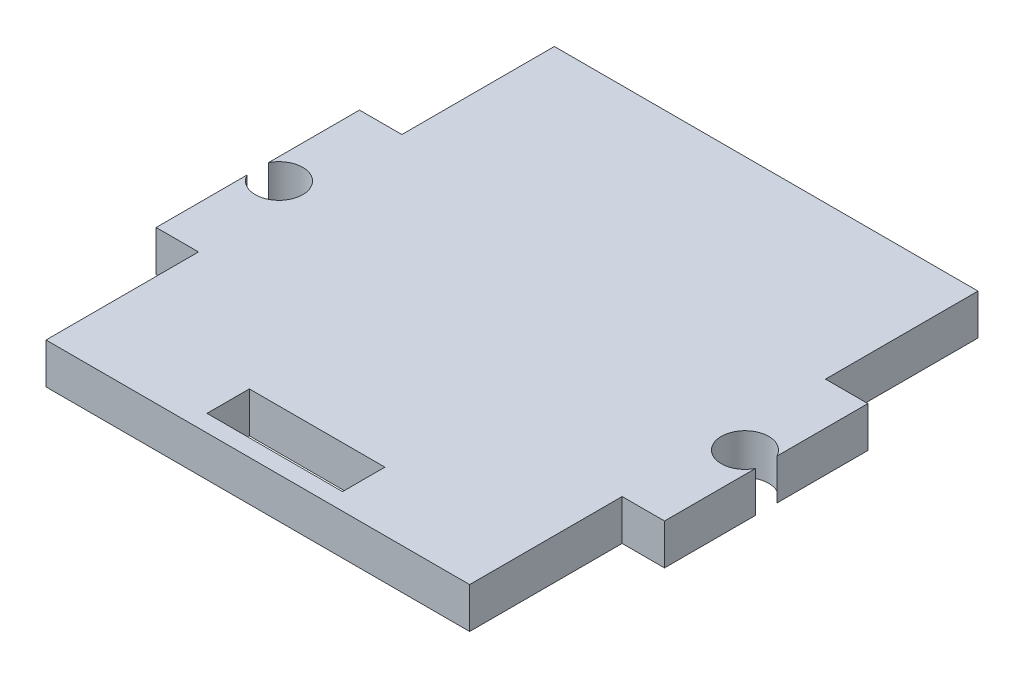
ISO-10303-21;
HEADER;
FILE_DESCRIPTION(('STEP AP214'),'2;1');
FILE_NAME('part.step','',(''),(''),'','','');
FILE_SCHEMA(('AUTOMOTIVE_DESIGN { 1 0 10303 214 1 1 1 1 }'));
ENDSEC;
DATA;
#1=APPLICATION_CONTEXT('core data for automotive mechanical design processes');
#2=APPLICATION_PROTOCOL_DEFINITION('international standard','automotive_design',2000,#1);
#3=PRODUCT_CONTEXT('',#1,'mechanical');
#4=PRODUCT('Part','Part','',(#3));
#5=PRODUCT_RELATED_PRODUCT_CATEGORY('part','',(#4));
#6=PRODUCT_DEFINITION_FORMATION('','',#4);
#7=PRODUCT_DEFINITION_CONTEXT('part definition',#1,'design');
#8=PRODUCT_DEFINITION('design','',#6,#7);
#9=PRODUCT_DEFINITION_SHAPE('','',#8);
#10=(LENGTH_UNIT() NAMED_UNIT(*) SI_UNIT(.MILLI.,.METRE.));
#11=(NAMED_UNIT(*) PLANE_ANGLE_UNIT() SI_UNIT($,.RADIAN.));
#12=(NAMED_UNIT(*) SI_UNIT($,.STERADIAN.) SOLID_ANGLE_UNIT());
#13=UNCERTAINTY_MEASURE_WITH_UNIT(LENGTH_MEASURE(1.E-05),#10,'distance_accuracy_value','');
#14=(GEOMETRIC_REPRESENTATION_CONTEXT(3) GLOBAL_UNCERTAINTY_ASSIGNED_CONTEXT((#13)) GLOBAL_UNIT_ASSIGNED_CONTEXT((#10,
#11,#12)) REPRESENTATION_CONTEXT('',''));
#15=CARTESIAN_POINT('',(0.,0.,0.));
#16=DIRECTION('',(0.,0.,1.));
#17=DIRECTION('',(1.,0.,0.));
#18=AXIS2_PLACEMENT_3D('',#15,#16,#17);
#19=CARTESIAN_POINT('',(3.175,3.048,0.));
#20=DIRECTION('',(0.,0.,-1.));
#21=DIRECTION('',(-1.,0.,0.));
#22=AXIS2_PLACEMENT_3D('',#19,#20,#21);
#23=PLANE('',#22);
#24=DIRECTION('',(1.,0.,0.));
#25=VECTOR('',#24,1.);
#26=CARTESIAN_POINT('',(3.175,0.,0.));
#27=LINE('',#26,#25);
#28=CARTESIAN_POINT('',(3.175,0.,0.));
#29=VERTEX_POINT('',#28);
#30=CARTESIAN_POINT('',(34.925,0.,0.));
#31=VERTEX_POINT('',#30);
#32=EDGE_CURVE('E202',#29,#31,#27,.T.);
#33=ORIENTED_EDGE('',*,*,#32,.T.);
#34=DIRECTION('',(0.,-1.,0.));
#35=VECTOR('',#34,1.);
#36=CARTESIAN_POINT('',(34.925,3.048,0.));
#37=LINE('',#36,#35);
#38=CARTESIAN_POINT('',(34.925,3.048,0.));
#39=VERTEX_POINT('',#38);
#40=EDGE_CURVE('E11',#39,#31,#37,.T.);
#41=ORIENTED_EDGE('',*,*,#40,.F.);
#42=DIRECTION('',(1.,0.,0.));
#43=VECTOR('',#42,1.);
#44=CARTESIAN_POINT('',(3.175,3.048,0.));
#45=LINE('',#44,#43);
#46=CARTESIAN_POINT('',(3.175,3.048,0.));
#47=VERTEX_POINT('',#46);
#48=EDGE_CURVE('E206',#47,#39,#45,.T.);
#49=ORIENTED_EDGE('',*,*,#48,.F.);
#50=DIRECTION('',(0.,-1.,0.));
#51=VECTOR('',#50,1.);
#52=CARTESIAN_POINT('',(3.175,3.048,0.));
#53=LINE('',#52,#51);
#54=EDGE_CURVE('E248',#47,#29,#53,.T.);
#55=ORIENTED_EDGE('',*,*,#54,.T.);
#56=EDGE_LOOP('',(#33,#41,#49,#55));
#57=FACE_BOUND('',#56,.T.);
#58=ADVANCED_FACE('F33',(#57),#23,.F.);
#59=CARTESIAN_POINT('',(34.925,3.048,0.));
#60=DIRECTION('',(-1.,0.,0.));
#61=DIRECTION('',(0.,0.,1.));
#62=AXIS2_PLACEMENT_3D('',#59,#60,#61);
#63=PLANE('',#62);
#64=DIRECTION('',(0.,0.,-1.));
#65=VECTOR('',#64,1.);
#66=CARTESIAN_POINT('',(34.925,0.,0.));
#67=LINE('',#66,#65);
#68=CARTESIAN_POINT('',(34.925,0.,-11.43));
#69=VERTEX_POINT('',#68);
#70=EDGE_CURVE('E251',#31,#69,#67,.T.);
#71=ORIENTED_EDGE('',*,*,#70,.T.);
#72=DIRECTION('',(0.,-1.,0.));
#73=VECTOR('',#72,1.);
#74=CARTESIAN_POINT('',(34.925,3.048,-11.43));
#75=LINE('',#74,#73);
#76=CARTESIAN_POINT('',(34.925,3.048,-11.43));
#77=VERTEX_POINT('',#76);
#78=EDGE_CURVE('E40',#77,#69,#75,.T.);
#79=ORIENTED_EDGE('',*,*,#78,.F.);
#80=DIRECTION('',(0.,0.,-1.));
#81=VECTOR('',#80,1.);
#82=CARTESIAN_POINT('',(34.925,3.048,0.));
#83=LINE('',#82,#81);
#84=EDGE_CURVE('E209',#39,#77,#83,.T.);
#85=ORIENTED_EDGE('',*,*,#84,.F.);
#86=ORIENTED_EDGE('',*,*,#40,.T.);
#87=EDGE_LOOP('',(#71,#79,#85,#86));
#88=FACE_BOUND('',#87,.T.);
#89=ADVANCED_FACE('F348',(#88),#63,.F.);
#90=CARTESIAN_POINT('',(34.925,3.048,-11.43));
#91=DIRECTION('',(0.,0.,-1.));
#92=DIRECTION('',(-1.,0.,0.));
#93=AXIS2_PLACEMENT_3D('',#90,#91,#92);
#94=PLANE('',#93);
#95=DIRECTION('',(1.,0.,0.));
#96=VECTOR('',#95,1.);
#97=CARTESIAN_POINT('',(34.925,0.,-11.43));
#98=LINE('',#97,#96);
#99=CARTESIAN_POINT('',(38.1,0.,-11.43));
#100=VERTEX_POINT('',#99);
#101=EDGE_CURVE('E253',#69,#100,#98,.T.);
#102=ORIENTED_EDGE('',*,*,#101,.T.);
#103=DIRECTION('',(0.,-1.,0.));
#104=VECTOR('',#103,1.);
#105=CARTESIAN_POINT('',(38.1,3.048,-11.43));
#106=LINE('',#105,#104);
#107=CARTESIAN_POINT('',(38.1,3.048,-11.43));
#108=VERTEX_POINT('',#107);
#109=EDGE_CURVE('E318',#108,#100,#106,.T.);
#110=ORIENTED_EDGE('',*,*,#109,.F.);
#111=DIRECTION('',(1.,0.,0.));
#112=VECTOR('',#111,1.);
#113=CARTESIAN_POINT('',(34.925,3.048,-11.43));
#114=LINE('',#113,#112);
#115=EDGE_CURVE('E212',#77,#108,#114,.T.);
#116=ORIENTED_EDGE('',*,*,#115,.F.);
#117=ORIENTED_EDGE('',*,*,#78,.T.);
#118=EDGE_LOOP('',(#102,#110,#116,#117));
#119=FACE_BOUND('',#118,.T.);
#120=ADVANCED_FACE('F325',(#119),#94,.F.);
#121=CARTESIAN_POINT('',(38.1,3.048,-11.43));
#122=DIRECTION('',(-1.,0.,0.));
#123=DIRECTION('',(0.,0.,1.));
#124=AXIS2_PLACEMENT_3D('',#121,#122,#123);
#125=PLANE('',#124);
#126=DIRECTION('',(0.,0.,-1.));
#127=VECTOR('',#126,1.);
#128=CARTESIAN_POINT('',(38.1,0.,-11.43));
#129=LINE('',#128,#127);
#130=CARTESIAN_POINT('',(38.1,0.,-18.2492954664797));
#131=VERTEX_POINT('',#130);
#132=EDGE_CURVE('E255',#100,#131,#129,.T.);
#133=ORIENTED_EDGE('',*,*,#132,.T.);
#134=DIRECTION('',(0.,-1.,0.));
#135=VECTOR('',#134,1.);
#136=CARTESIAN_POINT('',(38.1,3.048,-18.2492954664797));
#137=LINE('',#136,#135);
#138=CARTESIAN_POINT('',(38.1,3.048,-18.2492954664797));
#139=VERTEX_POINT('',#138);
#140=EDGE_CURVE('E315',#139,#131,#137,.T.);
#141=ORIENTED_EDGE('',*,*,#140,.F.);
#142=DIRECTION('',(0.,0.,-1.));
#143=VECTOR('',#142,1.);
#144=CARTESIAN_POINT('',(38.1,3.048,-11.43));
#145=LINE('',#144,#143);
#146=EDGE_CURVE('E214',#108,#139,#145,.T.);
#147=ORIENTED_EDGE('',*,*,#146,.F.);
#148=ORIENTED_EDGE('',*,*,#109,.T.);
#149=EDGE_LOOP('',(#133,#141,#147,#148));
#150=FACE_BOUND('',#149,.T.);
#151=ADVANCED_FACE('F334',(#150),#125,.F.);
#152=CARTESIAN_POINT('',(36.5125,3.048,-19.05));
#153=DIRECTION('',(0.,-1.,0.));
#154=DIRECTION('',(0.,0.,-1.));
#155=AXIS2_PLACEMENT_3D('',#152,#153,#154);
#156=CYLINDRICAL_SURFACE('',#155,1.778);
#157=CARTESIAN_POINT('',(36.5125,0.,-19.05));
#158=DIRECTION('',(0.,-1.,0.));
#159=DIRECTION('',(0.,0.,-1.));
#160=AXIS2_PLACEMENT_3D('',#157,#158,#159);
#161=CIRCLE('',#160,1.778);
#162=CARTESIAN_POINT('',(38.1,0.,-19.8507045335203));
#163=VERTEX_POINT('',#162);
#164=EDGE_CURVE('E257',#131,#163,#161,.T.);
#165=ORIENTED_EDGE('',*,*,#164,.T.);
#166=DIRECTION('',(0.,-1.,0.));
#167=VECTOR('',#166,1.);
#168=CARTESIAN_POINT('',(38.1,3.048,-19.8507045335203));
#169=LINE('',#168,#167);
#170=CARTESIAN_POINT('',(38.1,3.048,-19.8507045335203));
#171=VERTEX_POINT('',#170);
#172=EDGE_CURVE('E312',#171,#163,#169,.T.);
#173=ORIENTED_EDGE('',*,*,#172,.F.);
#174=CARTESIAN_POINT('',(36.5125,3.048,-19.05));
#175=DIRECTION('',(0.,-1.,0.));
#176=DIRECTION('',(0.,0.,-1.));
#177=AXIS2_PLACEMENT_3D('',#174,#175,#176);
#178=CIRCLE('',#177,1.778);
#179=EDGE_CURVE('E216',#139,#171,#178,.T.);
#180=ORIENTED_EDGE('',*,*,#179,.F.);
#181=ORIENTED_EDGE('',*,*,#140,.T.);
#182=EDGE_LOOP('',(#165,#173,#180,#181));
#183=FACE_BOUND('',#182,.T.);
#184=ADVANCED_FACE('F338',(#183),#156,.F.);
#185=CARTESIAN_POINT('',(38.1,3.048,-19.8507045335203));
#186=DIRECTION('',(-1.,0.,0.));
#187=DIRECTION('',(0.,0.,1.));
#188=AXIS2_PLACEMENT_3D('',#185,#186,#187);
#189=PLANE('',#188);
#190=DIRECTION('',(0.,0.,-1.));
#191=VECTOR('',#190,1.);
#192=CARTESIAN_POINT('',(38.1,0.,-19.8507045335203));
#193=LINE('',#192,#191);
#194=CARTESIAN_POINT('',(38.1,0.,-26.67));
#195=VERTEX_POINT('',#194);
#196=EDGE_CURVE('E259',#163,#195,#193,.T.);
#197=ORIENTED_EDGE('',*,*,#196,.T.);
#198=DIRECTION('',(0.,-1.,0.));
#199=VECTOR('',#198,1.);
#200=CARTESIAN_POINT('',(38.1,3.048,-26.67));
#201=LINE('',#200,#199);
#202=CARTESIAN_POINT('',(38.1,3.048,-26.67));
#203=VERTEX_POINT('',#202);
#204=EDGE_CURVE('E310',#203,#195,#201,.T.);
#205=ORIENTED_EDGE('',*,*,#204,.F.);
#206=DIRECTION('',(0.,0.,-1.));
#207=VECTOR('',#206,1.);
#208=CARTESIAN_POINT('',(38.1,3.048,-19.8507045335203));
#209=LINE('',#208,#207);
#210=EDGE_CURVE('E218',#171,#203,#209,.T.);
#211=ORIENTED_EDGE('',*,*,#210,.F.);
#212=ORIENTED_EDGE('',*,*,#172,.T.);
#213=EDGE_LOOP('',(#197,#205,#211,#212));
#214=FACE_BOUND('',#213,.T.);
#215=ADVANCED_FACE('F391',(#214),#189,.F.);
#216=CARTESIAN_POINT('',(34.925,3.048,-26.67));
#217=DIRECTION('',(0.,0.,-1.));
#218=DIRECTION('',(-1.,0.,0.));
#219=AXIS2_PLACEMENT_3D('',#216,#217,#218);
#220=PLANE('',#219);
#221=DIRECTION('',(1.,0.,0.));
#222=VECTOR('',#221,1.);
#223=CARTESIAN_POINT('',(34.925,0.,-26.67));
#224=LINE('',#223,#222);
#225=CARTESIAN_POINT('',(34.925,0.,-26.67));
#226=VERTEX_POINT('',#225);
#227=EDGE_CURVE('E262',#226,#195,#224,.T.);
#228=ORIENTED_EDGE('',*,*,#227,.F.);
#229=DIRECTION('',(0.,-1.,0.));
#230=VECTOR('',#229,1.);
#231=CARTESIAN_POINT('',(34.925,3.048,-26.67));
#232=LINE('',#231,#230);
#233=CARTESIAN_POINT('',(34.925,3.048,-26.67));
#234=VERTEX_POINT('',#233);
#235=EDGE_CURVE('E308',#234,#226,#232,.T.);
#236=ORIENTED_EDGE('',*,*,#235,.F.);
#237=DIRECTION('',(1.,0.,0.));
#238=VECTOR('',#237,1.);
#239=CARTESIAN_POINT('',(34.925,3.048,-26.67));
#240=LINE('',#239,#238);
#241=EDGE_CURVE('E220',#234,#203,#240,.T.);
#242=ORIENTED_EDGE('',*,*,#241,.T.);
#243=ORIENTED_EDGE('',*,*,#204,.T.);
#244=EDGE_LOOP('',(#228,#236,#242,#243));
#245=FACE_BOUND('',#244,.T.);
#246=ADVANCED_FACE('F389',(#245),#220,.T.);
#247=CARTESIAN_POINT('',(34.925,3.048,-38.1));
#248=DIRECTION('',(1.,0.,0.));
#249=DIRECTION('',(0.,0.,-1.));
#250=AXIS2_PLACEMENT_3D('',#247,#248,#249);
#251=PLANE('',#250);
#252=DIRECTION('',(0.,0.,1.));
#253=VECTOR('',#252,1.);
#254=CARTESIAN_POINT('',(34.925,0.,-38.1));
#255=LINE('',#254,#253);
#256=CARTESIAN_POINT('',(34.925,0.,-38.1));
#257=VERTEX_POINT('',#256);
#258=EDGE_CURVE('E265',#257,#226,#255,.T.);
#259=ORIENTED_EDGE('',*,*,#258,.F.);
#260=DIRECTION('',(0.,-1.,0.));
#261=VECTOR('',#260,1.);
#262=CARTESIAN_POINT('',(34.925,3.048,-38.1));
#263=LINE('',#262,#261);
#264=CARTESIAN_POINT('',(34.925,3.048,-38.1));
#265=VERTEX_POINT('',#264);
#266=EDGE_CURVE('E306',#265,#257,#263,.T.);
#267=ORIENTED_EDGE('',*,*,#266,.F.);
#268=DIRECTION('',(0.,0.,1.));
#269=VECTOR('',#268,1.);
#270=CARTESIAN_POINT('',(34.925,3.048,-38.1));
#271=LINE('',#270,#269);
#272=EDGE_CURVE('E223',#265,#234,#271,.T.);
#273=ORIENTED_EDGE('',*,*,#272,.T.);
#274=ORIENTED_EDGE('',*,*,#235,.T.);
#275=EDGE_LOOP('',(#259,#267,#273,#274));
#276=FACE_BOUND('',#275,.T.);
#277=ADVANCED_FACE('F386',(#276),#251,.T.);
#278=CARTESIAN_POINT('',(3.175,3.048,-38.1));
#279=DIRECTION('',(0.,0.,-1.));
#280=DIRECTION('',(-1.,0.,0.));
#281=AXIS2_PLACEMENT_3D('',#278,#279,#280);
#282=PLANE('',#281);
#283=DIRECTION('',(1.,0.,0.));
#284=VECTOR('',#283,1.);
#285=CARTESIAN_POINT('',(3.175,0.,-38.1));
#286=LINE('',#285,#284);
#287=CARTESIAN_POINT('',(3.175,0.,-38.1));
#288=VERTEX_POINT('',#287);
#289=EDGE_CURVE('E268',#288,#257,#286,.T.);
#290=ORIENTED_EDGE('',*,*,#289,.F.);
#291=DIRECTION('',(0.,-1.,0.));
#292=VECTOR('',#291,1.);
#293=CARTESIAN_POINT('',(3.175,3.048,-38.1));
#294=LINE('',#293,#292);
#295=CARTESIAN_POINT('',(3.175,3.048,-38.1));
#296=VERTEX_POINT('',#295);
#297=EDGE_CURVE('E304',#296,#288,#294,.T.);
#298=ORIENTED_EDGE('',*,*,#297,.F.);
#299=DIRECTION('',(1.,0.,0.));
#300=VECTOR('',#299,1.);
#301=CARTESIAN_POINT('',(3.175,3.048,-38.1));
#302=LINE('',#301,#300);
#303=EDGE_CURVE('E226',#296,#265,#302,.T.);
#304=ORIENTED_EDGE('',*,*,#303,.T.);
#305=ORIENTED_EDGE('',*,*,#266,.T.);
#306=EDGE_LOOP('',(#290,#298,#304,#305));
#307=FACE_BOUND('',#306,.T.);
#308=ADVANCED_FACE('F382',(#307),#282,.T.);
#309=CARTESIAN_POINT('',(3.175,3.048,-38.1));
#310=DIRECTION('',(1.,0.,0.));
#311=DIRECTION('',(0.,0.,-1.));
#312=AXIS2_PLACEMENT_3D('',#309,#310,#311);
#313=PLANE('',#312);
#314=DIRECTION('',(0.,0.,1.));
#315=VECTOR('',#314,1.);
#316=CARTESIAN_POINT('',(3.175,0.,-38.1));
#317=LINE('',#316,#315);
#318=CARTESIAN_POINT('',(3.175,0.,-26.67));
#319=VERTEX_POINT('',#318);
#320=EDGE_CURVE('E271',#288,#319,#317,.T.);
#321=ORIENTED_EDGE('',*,*,#320,.T.);
#322=DIRECTION('',(0.,-1.,0.));
#323=VECTOR('',#322,1.);
#324=CARTESIAN_POINT('',(3.175,3.048,-26.67));
#325=LINE('',#324,#323);
#326=CARTESIAN_POINT('',(3.175,3.048,-26.67));
#327=VERTEX_POINT('',#326);
#328=EDGE_CURVE('E301',#327,#319,#325,.T.);
#329=ORIENTED_EDGE('',*,*,#328,.F.);
#330=DIRECTION('',(0.,0.,1.));
#331=VECTOR('',#330,1.);
#332=CARTESIAN_POINT('',(3.175,3.048,-38.1));
#333=LINE('',#332,#331);
#334=EDGE_CURVE('E229',#296,#327,#333,.T.);
#335=ORIENTED_EDGE('',*,*,#334,.F.);
#336=ORIENTED_EDGE('',*,*,#297,.T.);
#337=EDGE_LOOP('',(#321,#329,#335,#336));
#338=FACE_BOUND('',#337,.T.);
#339=ADVANCED_FACE('F379',(#338),#313,.F.);
#340=CARTESIAN_POINT('',(3.175,3.048,-26.67));
#341=DIRECTION('',(0.,0.,1.));
#342=DIRECTION('',(1.,0.,0.));
#343=AXIS2_PLACEMENT_3D('',#340,#341,#342);
#344=PLANE('',#343);
#345=DIRECTION('',(-1.,0.,0.));
#346=VECTOR('',#345,1.);
#347=CARTESIAN_POINT('',(3.175,0.,-26.67));
#348=LINE('',#347,#346);
#349=CARTESIAN_POINT('',(0.,0.,-26.67));
#350=VERTEX_POINT('',#349);
#351=EDGE_CURVE('E273',#319,#350,#348,.T.);
#352=ORIENTED_EDGE('',*,*,#351,.T.);
#353=DIRECTION('',(0.,-1.,0.));
#354=VECTOR('',#353,1.);
#355=CARTESIAN_POINT('',(0.,3.048,-26.67));
#356=LINE('',#355,#354);
#357=CARTESIAN_POINT('',(0.,3.048,-26.67));
#358=VERTEX_POINT('',#357);
#359=EDGE_CURVE('E299',#358,#350,#356,.T.);
#360=ORIENTED_EDGE('',*,*,#359,.F.);
#361=DIRECTION('',(-1.,0.,0.));
#362=VECTOR('',#361,1.);
#363=CARTESIAN_POINT('',(3.175,3.048,-26.67));
#364=LINE('',#363,#362);
#365=EDGE_CURVE('E231',#327,#358,#364,.T.);
#366=ORIENTED_EDGE('',*,*,#365,.F.);
#367=ORIENTED_EDGE('',*,*,#328,.T.);
#368=EDGE_LOOP('',(#352,#360,#366,#367));
#369=FACE_BOUND('',#368,.T.);
#370=ADVANCED_FACE('F374',(#369),#344,.F.);
#371=CARTESIAN_POINT('',(0.,3.048,-19.8507045335203));
#372=DIRECTION('',(-1.,0.,0.));
#373=DIRECTION('',(0.,0.,1.));
#374=AXIS2_PLACEMENT_3D('',#371,#372,#373);
#375=PLANE('',#374);
#376=DIRECTION('',(0.,0.,-1.));
#377=VECTOR('',#376,1.);
#378=CARTESIAN_POINT('',(0.,0.,-19.8507045335203));
#379=LINE('',#378,#377);
#380=CARTESIAN_POINT('',(0.,0.,-19.8507045335203));
#381=VERTEX_POINT('',#380);
#382=EDGE_CURVE('E276',#381,#350,#379,.T.);
#383=ORIENTED_EDGE('',*,*,#382,.F.);
#384=DIRECTION('',(0.,-1.,0.));
#385=VECTOR('',#384,1.);
#386=CARTESIAN_POINT('',(0.,3.048,-19.8507045335203));
#387=LINE('',#386,#385);
#388=CARTESIAN_POINT('',(0.,3.048,-19.8507045335203));
#389=VERTEX_POINT('',#388);
#390=EDGE_CURVE('E297',#389,#381,#387,.T.);
#391=ORIENTED_EDGE('',*,*,#390,.F.);
#392=DIRECTION('',(0.,0.,-1.));
#393=VECTOR('',#392,1.);
#394=CARTESIAN_POINT('',(0.,3.048,-19.8507045335203));
#395=LINE('',#394,#393);
#396=EDGE_CURVE('E233',#389,#358,#395,.T.);
#397=ORIENTED_EDGE('',*,*,#396,.T.);
#398=ORIENTED_EDGE('',*,*,#359,.T.);
#399=EDGE_LOOP('',(#383,#391,#397,#398));
#400=FACE_BOUND('',#399,.T.);
#401=ADVANCED_FACE('F368',(#400),#375,.T.);
#402=CARTESIAN_POINT('',(1.5875,3.048,-19.05));
#403=DIRECTION('',(0.,-1.,0.));
#404=DIRECTION('',(0.,0.,-1.));
#405=AXIS2_PLACEMENT_3D('',#402,#403,#404);
#406=CYLINDRICAL_SURFACE('',#405,1.778);
#407=CARTESIAN_POINT('',(1.5875,0.,-19.05));
#408=DIRECTION('',(0.,1.,0.));
#409=DIRECTION('',(0.,0.,1.));
#410=AXIS2_PLACEMENT_3D('',#407,#408,#409);
#411=CIRCLE('',#410,1.778);
#412=CARTESIAN_POINT('',(0.,0.,-18.2492954664797));
#413=VERTEX_POINT('',#412);
#414=EDGE_CURVE('E279',#413,#381,#411,.T.);
#415=ORIENTED_EDGE('',*,*,#414,.F.);
#416=DIRECTION('',(0.,-1.,0.));
#417=VECTOR('',#416,1.);
#418=CARTESIAN_POINT('',(0.,3.048,-18.2492954664797));
#419=LINE('',#418,#417);
#420=CARTESIAN_POINT('',(0.,3.048,-18.2492954664797));
#421=VERTEX_POINT('',#420);
#422=EDGE_CURVE('E295',#421,#413,#419,.T.);
#423=ORIENTED_EDGE('',*,*,#422,.F.);
#424=CARTESIAN_POINT('',(1.5875,3.048,-19.05));
#425=DIRECTION('',(0.,1.,0.));
#426=DIRECTION('',(0.,0.,1.));
#427=AXIS2_PLACEMENT_3D('',#424,#425,#426);
#428=CIRCLE('',#427,1.778);
#429=EDGE_CURVE('E236',#421,#389,#428,.T.);
#430=ORIENTED_EDGE('',*,*,#429,.T.);
#431=ORIENTED_EDGE('',*,*,#390,.T.);
#432=EDGE_LOOP('',(#415,#423,#430,#431));
#433=FACE_BOUND('',#432,.T.);
#434=ADVANCED_FACE('F364',(#433),#406,.F.);
#435=CARTESIAN_POINT('',(0.,3.048,-11.43));
#436=DIRECTION('',(-1.,0.,0.));
#437=DIRECTION('',(0.,0.,1.));
#438=AXIS2_PLACEMENT_3D('',#435,#436,#437);
#439=PLANE('',#438);
#440=DIRECTION('',(0.,0.,-1.));
#441=VECTOR('',#440,1.);
#442=CARTESIAN_POINT('',(0.,0.,-11.43));
#443=LINE('',#442,#441);
#444=CARTESIAN_POINT('',(0.,0.,-11.43));
#445=VERTEX_POINT('',#444);
#446=EDGE_CURVE('E282',#445,#413,#443,.T.);
#447=ORIENTED_EDGE('',*,*,#446,.F.);
#448=DIRECTION('',(0.,-1.,0.));
#449=VECTOR('',#448,1.);
#450=CARTESIAN_POINT('',(0.,3.048,-11.43));
#451=LINE('',#450,#449);
#452=CARTESIAN_POINT('',(0.,3.048,-11.43));
#453=VERTEX_POINT('',#452);
#454=EDGE_CURVE('E293',#453,#445,#451,.T.);
#455=ORIENTED_EDGE('',*,*,#454,.F.);
#456=DIRECTION('',(0.,0.,-1.));
#457=VECTOR('',#456,1.);
#458=CARTESIAN_POINT('',(0.,3.048,-11.43));
#459=LINE('',#458,#457);
#460=EDGE_CURVE('E239',#453,#421,#459,.T.);
#461=ORIENTED_EDGE('',*,*,#460,.T.);
#462=ORIENTED_EDGE('',*,*,#422,.T.);
#463=EDGE_LOOP('',(#447,#455,#461,#462));
#464=FACE_BOUND('',#463,.T.);
#465=ADVANCED_FACE('F360',(#464),#439,.T.);
#466=CARTESIAN_POINT('',(3.175,3.048,-11.43));
#467=DIRECTION('',(0.,0.,1.));
#468=DIRECTION('',(1.,0.,0.));
#469=AXIS2_PLACEMENT_3D('',#466,#467,#468);
#470=PLANE('',#469);
#471=DIRECTION('',(-1.,0.,0.));
#472=VECTOR('',#471,1.);
#473=CARTESIAN_POINT('',(3.175,0.,-11.43));
#474=LINE('',#473,#472);
#475=CARTESIAN_POINT('',(3.175,0.,-11.43));
#476=VERTEX_POINT('',#475);
#477=EDGE_CURVE('E285',#476,#445,#474,.T.);
#478=ORIENTED_EDGE('',*,*,#477,.F.);
#479=DIRECTION('',(0.,-1.,0.));
#480=VECTOR('',#479,1.);
#481=CARTESIAN_POINT('',(3.175,3.048,-11.43));
#482=LINE('',#481,#480);
#483=CARTESIAN_POINT('',(3.175,3.048,-11.43));
#484=VERTEX_POINT('',#483);
#485=EDGE_CURVE('E291',#484,#476,#482,.T.);
#486=ORIENTED_EDGE('',*,*,#485,.F.);
#487=DIRECTION('',(-1.,0.,0.));
#488=VECTOR('',#487,1.);
#489=CARTESIAN_POINT('',(3.175,3.048,-11.43));
#490=LINE('',#489,#488);
#491=EDGE_CURVE('E242',#484,#453,#490,.T.);
#492=ORIENTED_EDGE('',*,*,#491,.T.);
#493=ORIENTED_EDGE('',*,*,#454,.T.);
#494=EDGE_LOOP('',(#478,#486,#492,#493));
#495=FACE_BOUND('',#494,.T.);
#496=ADVANCED_FACE('F356',(#495),#470,.T.);
#497=CARTESIAN_POINT('',(3.175,3.048,0.));
#498=DIRECTION('',(-1.,0.,0.));
#499=DIRECTION('',(0.,0.,1.));
#500=AXIS2_PLACEMENT_3D('',#497,#498,#499);
#501=PLANE('',#500);
#502=DIRECTION('',(0.,0.,-1.));
#503=VECTOR('',#502,1.);
#504=CARTESIAN_POINT('',(3.175,0.,0.));
#505=LINE('',#504,#503);
#506=EDGE_CURVE('E210',#29,#476,#505,.T.);
#507=ORIENTED_EDGE('',*,*,#506,.F.);
#508=ORIENTED_EDGE('',*,*,#54,.F.);
#509=DIRECTION('',(0.,0.,-1.));
#510=VECTOR('',#509,1.);
#511=CARTESIAN_POINT('',(3.175,3.048,0.));
#512=LINE('',#511,#510);
#513=EDGE_CURVE('E245',#47,#484,#512,.T.);
#514=ORIENTED_EDGE('',*,*,#513,.T.);
#515=ORIENTED_EDGE('',*,*,#485,.T.);
#516=EDGE_LOOP('',(#507,#508,#514,#515));
#517=FACE_BOUND('',#516,.T.);
#518=ADVANCED_FACE('F352',(#517),#501,.T.);
#519=CARTESIAN_POINT('',(36.5125,3.048,-19.05));
#520=DIRECTION('',(0.,-1.,0.));
#521=DIRECTION('',(0.,0.,-1.));
#522=AXIS2_PLACEMENT_3D('',#519,#520,#521);
#523=PLANE('',#522);
#524=DIRECTION('',(1.,0.,0.));
#525=VECTOR('',#524,1.);
#526=CARTESIAN_POINT('',(13.97,3.048,-1.27));
#527=LINE('',#526,#525);
#528=CARTESIAN_POINT('',(13.97,3.048,-1.27));
#529=VERTEX_POINT('',#528);
#530=CARTESIAN_POINT('',(24.13,3.048,-1.27));
#531=VERTEX_POINT('',#530);
#532=EDGE_CURVE('E196',#529,#531,#527,.T.);
#533=ORIENTED_EDGE('',*,*,#532,.F.);
#534=DIRECTION('',(0.,0.,1.));
#535=VECTOR('',#534,1.);
#536=CARTESIAN_POINT('',(13.97,3.048,-4.445));
#537=LINE('',#536,#535);
#538=CARTESIAN_POINT('',(13.97,3.048,-4.445));
#539=VERTEX_POINT('',#538);
#540=EDGE_CURVE('E47',#539,#529,#537,.T.);
#541=ORIENTED_EDGE('',*,*,#540,.F.);
#542=DIRECTION('',(-1.,0.,0.));
#543=VECTOR('',#542,1.);
#544=CARTESIAN_POINT('',(13.97,3.048,-4.445));
#545=LINE('',#544,#543);
#546=CARTESIAN_POINT('',(24.13,3.048,-4.445));
#547=VERTEX_POINT('',#546);
#548=EDGE_CURVE('E187',#547,#539,#545,.T.);
#549=ORIENTED_EDGE('',*,*,#548,.F.);
#550=DIRECTION('',(0.,0.,-1.));
#551=VECTOR('',#550,1.);
#552=CARTESIAN_POINT('',(24.13,3.048,-4.445));
#553=LINE('',#552,#551);
#554=EDGE_CURVE('E190',#531,#547,#553,.T.);
#555=ORIENTED_EDGE('',*,*,#554,.F.);
#556=EDGE_LOOP('',(#533,#541,#549,#555));
#557=FACE_BOUND('',#556,.T.);
#558=ORIENTED_EDGE('',*,*,#48,.T.);
#559=ORIENTED_EDGE('',*,*,#84,.T.);
#560=ORIENTED_EDGE('',*,*,#115,.T.);
#561=ORIENTED_EDGE('',*,*,#146,.T.);
#562=ORIENTED_EDGE('',*,*,#179,.T.);
#563=ORIENTED_EDGE('',*,*,#210,.T.);
#564=ORIENTED_EDGE('',*,*,#241,.F.);
#565=ORIENTED_EDGE('',*,*,#272,.F.);
#566=ORIENTED_EDGE('',*,*,#303,.F.);
#567=ORIENTED_EDGE('',*,*,#334,.T.);
#568=ORIENTED_EDGE('',*,*,#365,.T.);
#569=ORIENTED_EDGE('',*,*,#396,.F.);
#570=ORIENTED_EDGE('',*,*,#429,.F.);
#571=ORIENTED_EDGE('',*,*,#460,.F.);
#572=ORIENTED_EDGE('',*,*,#491,.F.);
#573=ORIENTED_EDGE('',*,*,#513,.F.);
#574=EDGE_LOOP('',(#558,#559,#560,#561,#562,#563,#564,#565,#566,#567,#568,#569,#570,#571,#572,#573));
#575=FACE_BOUND('',#574,.T.);
#576=ADVANCED_FACE('F342',(#557,#575),#523,.F.);
#577=CARTESIAN_POINT('',(36.5125,0.,-19.05));
#578=DIRECTION('',(0.,-1.,0.));
#579=DIRECTION('',(0.,0.,-1.));
#580=AXIS2_PLACEMENT_3D('',#577,#578,#579);
#581=PLANE('',#580);
#582=DIRECTION('',(0.,0.,1.));
#583=VECTOR('',#582,1.);
#584=CARTESIAN_POINT('',(13.97,0.,-4.445));
#585=LINE('',#584,#583);
#586=CARTESIAN_POINT('',(13.97,0.,-4.445));
#587=VERTEX_POINT('',#586);
#588=CARTESIAN_POINT('',(13.97,0.,-1.27));
#589=VERTEX_POINT('',#588);
#590=EDGE_CURVE('E171',#587,#589,#585,.T.);
#591=ORIENTED_EDGE('',*,*,#590,.T.);
#592=DIRECTION('',(1.,0.,0.));
#593=VECTOR('',#592,1.);
#594=CARTESIAN_POINT('',(13.97,0.,-1.27));
#595=LINE('',#594,#593);
#596=CARTESIAN_POINT('',(24.13,0.,-1.27));
#597=VERTEX_POINT('',#596);
#598=EDGE_CURVE('E180',#589,#597,#595,.T.);
#599=ORIENTED_EDGE('',*,*,#598,.T.);
#600=DIRECTION('',(0.,0.,-1.));
#601=VECTOR('',#600,1.);
#602=CARTESIAN_POINT('',(24.13,0.,-4.445));
#603=LINE('',#602,#601);
#604=CARTESIAN_POINT('',(24.13,0.,-4.445));
#605=VERTEX_POINT('',#604);
#606=EDGE_CURVE('E55',#597,#605,#603,.T.);
#607=ORIENTED_EDGE('',*,*,#606,.T.);
#608=DIRECTION('',(-1.,0.,0.));
#609=VECTOR('',#608,1.);
#610=CARTESIAN_POINT('',(13.97,0.,-4.445));
#611=LINE('',#610,#609);
#612=EDGE_CURVE('E177',#605,#587,#611,.T.);
#613=ORIENTED_EDGE('',*,*,#612,.T.);
#614=EDGE_LOOP('',(#591,#599,#607,#613));
#615=FACE_BOUND('',#614,.T.);
#616=ORIENTED_EDGE('',*,*,#32,.F.);
#617=ORIENTED_EDGE('',*,*,#506,.T.);
#618=ORIENTED_EDGE('',*,*,#477,.T.);
#619=ORIENTED_EDGE('',*,*,#446,.T.);
#620=ORIENTED_EDGE('',*,*,#414,.T.);
#621=ORIENTED_EDGE('',*,*,#382,.T.);
#622=ORIENTED_EDGE('',*,*,#351,.F.);
#623=ORIENTED_EDGE('',*,*,#320,.F.);
#624=ORIENTED_EDGE('',*,*,#289,.T.);
#625=ORIENTED_EDGE('',*,*,#258,.T.);
#626=ORIENTED_EDGE('',*,*,#227,.T.);
#627=ORIENTED_EDGE('',*,*,#196,.F.);
#628=ORIENTED_EDGE('',*,*,#164,.F.);
#629=ORIENTED_EDGE('',*,*,#132,.F.);
#630=ORIENTED_EDGE('',*,*,#101,.F.);
#631=ORIENTED_EDGE('',*,*,#70,.F.);
#632=EDGE_LOOP('',(#616,#617,#618,#619,#620,#621,#622,#623,#624,#625,#626,#627,#628,#629,#630,#631));
#633=FACE_BOUND('',#632,.T.);
#634=ADVANCED_FACE('F184',(#615,#633),#581,.T.);
#635=CARTESIAN_POINT('',(13.97,0.,-4.445));
#636=DIRECTION('',(-1.,0.,0.));
#637=DIRECTION('',(0.,0.,1.));
#638=AXIS2_PLACEMENT_3D('',#635,#636,#637);
#639=PLANE('',#638);
#640=ORIENTED_EDGE('',*,*,#540,.T.);
#641=DIRECTION('',(0.,1.,0.));
#642=VECTOR('',#641,1.);
#643=CARTESIAN_POINT('',(13.97,0.,-1.27));
#644=LINE('',#643,#642);
#645=EDGE_CURVE('E167',#589,#529,#644,.T.);
#646=ORIENTED_EDGE('',*,*,#645,.F.);
#647=ORIENTED_EDGE('',*,*,#590,.F.);
#648=DIRECTION('',(0.,1.,0.));
#649=VECTOR('',#648,1.);
#650=CARTESIAN_POINT('',(13.97,0.,-4.445));
#651=LINE('',#650,#649);
#652=EDGE_CURVE('E200',#587,#539,#651,.T.);
#653=ORIENTED_EDGE('',*,*,#652,.T.);
#654=EDGE_LOOP('',(#640,#646,#647,#653));
#655=FACE_BOUND('',#654,.T.);
#656=ADVANCED_FACE('F169',(#655),#639,.F.);
#657=CARTESIAN_POINT('',(13.97,0.,-4.445));
#658=DIRECTION('',(0.,0.,-1.));
#659=DIRECTION('',(-1.,0.,0.));
#660=AXIS2_PLACEMENT_3D('',#657,#658,#659);
#661=PLANE('',#660);
#662=ORIENTED_EDGE('',*,*,#548,.T.);
#663=ORIENTED_EDGE('',*,*,#652,.F.);
#664=ORIENTED_EDGE('',*,*,#612,.F.);
#665=DIRECTION('',(0.,1.,0.));
#666=VECTOR('',#665,1.);
#667=CARTESIAN_POINT('',(24.13,0.,-4.445));
#668=LINE('',#667,#666);
#669=EDGE_CURVE('E203',#605,#547,#668,.T.);
#670=ORIENTED_EDGE('',*,*,#669,.T.);
#671=EDGE_LOOP('',(#662,#663,#664,#670));
#672=FACE_BOUND('',#671,.T.);
#673=ADVANCED_FACE('F526',(#672),#661,.F.);
#674=CARTESIAN_POINT('',(24.13,0.,-4.445));
#675=DIRECTION('',(1.,0.,0.));
#676=DIRECTION('',(0.,0.,-1.));
#677=AXIS2_PLACEMENT_3D('',#674,#675,#676);
#678=PLANE('',#677);
#679=ORIENTED_EDGE('',*,*,#554,.T.);
#680=ORIENTED_EDGE('',*,*,#669,.F.);
#681=ORIENTED_EDGE('',*,*,#606,.F.);
#682=DIRECTION('',(0.,1.,0.));
#683=VECTOR('',#682,1.);
#684=CARTESIAN_POINT('',(24.13,0.,-1.27));
#685=LINE('',#684,#683);
#686=EDGE_CURVE('E176',#597,#531,#685,.T.);
#687=ORIENTED_EDGE('',*,*,#686,.T.);
#688=EDGE_LOOP('',(#679,#680,#681,#687));
#689=FACE_BOUND('',#688,.T.);
#690=ADVANCED_FACE('F535',(#689),#678,.F.);
#691=CARTESIAN_POINT('',(13.97,0.,-1.27));
#692=DIRECTION('',(0.,0.,1.));
#693=DIRECTION('',(1.,0.,0.));
#694=AXIS2_PLACEMENT_3D('',#691,#692,#693);
#695=PLANE('',#694);
#696=ORIENTED_EDGE('',*,*,#532,.T.);
#697=ORIENTED_EDGE('',*,*,#686,.F.);
#698=ORIENTED_EDGE('',*,*,#598,.F.);
#699=ORIENTED_EDGE('',*,*,#645,.T.);
#700=EDGE_LOOP('',(#696,#697,#698,#699));
#701=FACE_BOUND('',#700,.T.);
#702=ADVANCED_FACE('F181',(#701),#695,.F.);
#703=CLOSED_SHELL('',(#58,#89,#120,#151,#184,#215,#246,#277,#308,#339,#370,#401,#434,#465,#496,
#518,#576,#634,#656,#673,#690,#702));
#704=MANIFOLD_SOLID_BREP('B2',#703);
#705=ADVANCED_BREP_SHAPE_REPRESENTATION('',(#18,#704),#14);
#706=SHAPE_DEFINITION_REPRESENTATION(#9,#705);
ENDSEC;
END-ISO-10303-21;
